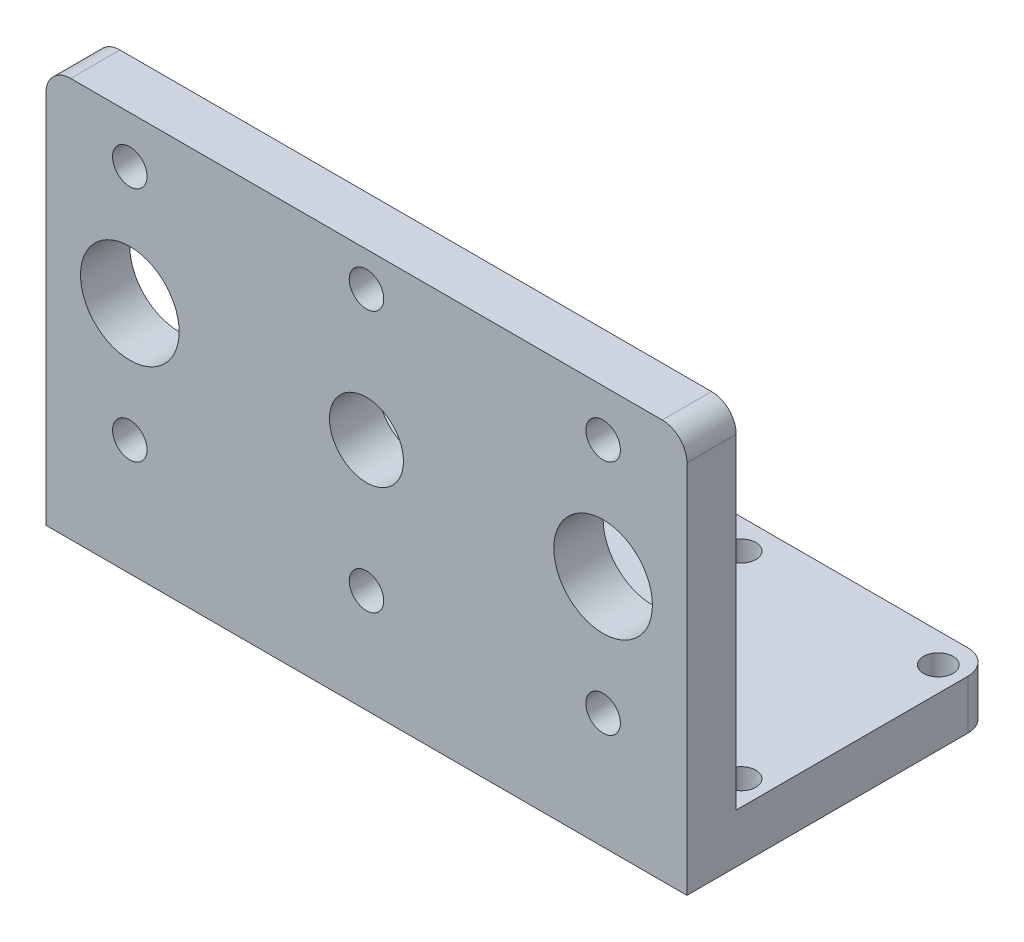
ISO-10303-21;
HEADER;
FILE_DESCRIPTION(('STEP AP214'),'2;1');
FILE_NAME('part.step','',(''),(''),'','','');
FILE_SCHEMA(('AUTOMOTIVE_DESIGN { 1 0 10303 214 1 1 1 1 }'));
ENDSEC;
DATA;
#1=APPLICATION_CONTEXT('core data for automotive mechanical design processes');
#2=APPLICATION_PROTOCOL_DEFINITION('international standard','automotive_design',2000,#1);
#3=PRODUCT_CONTEXT('',#1,'mechanical');
#4=PRODUCT('Part','Part','',(#3));
#5=PRODUCT_RELATED_PRODUCT_CATEGORY('part','',(#4));
#6=PRODUCT_DEFINITION_FORMATION('','',#4);
#7=PRODUCT_DEFINITION_CONTEXT('part definition',#1,'design');
#8=PRODUCT_DEFINITION('design','',#6,#7);
#9=PRODUCT_DEFINITION_SHAPE('','',#8);
#10=(LENGTH_UNIT() NAMED_UNIT(*) SI_UNIT(.MILLI.,.METRE.));
#11=(NAMED_UNIT(*) PLANE_ANGLE_UNIT() SI_UNIT($,.RADIAN.));
#12=(NAMED_UNIT(*) SI_UNIT($,.STERADIAN.) SOLID_ANGLE_UNIT());
#13=UNCERTAINTY_MEASURE_WITH_UNIT(LENGTH_MEASURE(1.E-05),#10,'distance_accuracy_value','');
#14=(GEOMETRIC_REPRESENTATION_CONTEXT(3) GLOBAL_UNCERTAINTY_ASSIGNED_CONTEXT((#13)) GLOBAL_UNIT_ASSIGNED_CONTEXT((#10,
#11,#12)) REPRESENTATION_CONTEXT('',''));
#15=CARTESIAN_POINT('',(0.,0.,0.));
#16=DIRECTION('',(0.,0.,1.));
#17=DIRECTION('',(1.,0.,0.));
#18=AXIS2_PLACEMENT_3D('',#15,#16,#17);
#19=CARTESIAN_POINT('',(0.,10.,0.));
#20=DIRECTION('',(-1.,0.,0.));
#21=DIRECTION('',(0.,0.,1.));
#22=AXIS2_PLACEMENT_3D('',#19,#20,#21);
#23=PLANE('',#22);
#24=DIRECTION('',(0.,0.,-1.));
#25=VECTOR('',#24,1.);
#26=CARTESIAN_POINT('',(0.,10.,0.));
#27=LINE('',#26,#25);
#28=CARTESIAN_POINT('',(0.,10.,28.9769966783702));
#29=VERTEX_POINT('',#28);
#30=CARTESIAN_POINT('',(0.,10.,-18.));
#31=VERTEX_POINT('',#30);
#32=EDGE_CURVE('E431',#29,#31,#27,.T.);
#33=ORIENTED_EDGE('',*,*,#32,.T.);
#34=DIRECTION('',(0.,1.,0.));
#35=VECTOR('',#34,1.);
#36=CARTESIAN_POINT('',(0.,0.,-18.));
#37=LINE('',#36,#35);
#38=CARTESIAN_POINT('',(0.,0.,-18.));
#39=VERTEX_POINT('',#38);
#40=EDGE_CURVE('E272',#31,#39,#37,.F.);
#41=ORIENTED_EDGE('',*,*,#40,.T.);
#42=DIRECTION('',(0.,0.,-1.));
#43=VECTOR('',#42,1.);
#44=CARTESIAN_POINT('',(0.,0.,0.));
#45=LINE('',#44,#43);
#46=CARTESIAN_POINT('',(0.,0.,38.98));
#47=VERTEX_POINT('',#46);
#48=EDGE_CURVE('E290',#47,#39,#45,.T.);
#49=ORIENTED_EDGE('',*,*,#48,.F.);
#50=DIRECTION('',(0.,-1.,0.));
#51=VECTOR('',#50,1.);
#52=CARTESIAN_POINT('',(0.,0.,38.98));
#53=LINE('',#52,#51);
#54=CARTESIAN_POINT('',(0.,76.,38.98));
#55=VERTEX_POINT('',#54);
#56=EDGE_CURVE('E152',#55,#47,#53,.T.);
#57=ORIENTED_EDGE('',*,*,#56,.F.);
#58=DIRECTION('',(0.,0.,1.));
#59=VECTOR('',#58,1.);
#60=CARTESIAN_POINT('',(0.,76.,0.));
#61=LINE('',#60,#59);
#62=CARTESIAN_POINT('',(0.,76.,28.9769966783702));
#63=VERTEX_POINT('',#62);
#64=EDGE_CURVE('E127',#55,#63,#61,.F.);
#65=ORIENTED_EDGE('',*,*,#64,.T.);
#66=DIRECTION('',(0.,-1.,0.));
#67=VECTOR('',#66,1.);
#68=CARTESIAN_POINT('',(0.,85.,28.9769966783702));
#69=LINE('',#68,#67);
#70=EDGE_CURVE('E242',#63,#29,#69,.T.);
#71=ORIENTED_EDGE('',*,*,#70,.T.);
#72=EDGE_LOOP('',(#33,#41,#49,#57,#65,#71));
#73=FACE_BOUND('',#72,.T.);
#74=ADVANCED_FACE('F44',(#73),#23,.T.);
#75=CARTESIAN_POINT('',(130.,10.,0.));
#76=DIRECTION('',(-1.,0.,0.));
#77=DIRECTION('',(0.,0.,1.));
#78=AXIS2_PLACEMENT_3D('',#75,#76,#77);
#79=PLANE('',#78);
#80=DIRECTION('',(0.,0.,-1.));
#81=VECTOR('',#80,1.);
#82=CARTESIAN_POINT('',(130.,0.,0.));
#83=LINE('',#82,#81);
#84=CARTESIAN_POINT('',(130.,0.,38.98));
#85=VERTEX_POINT('',#84);
#86=CARTESIAN_POINT('',(130.,0.,-18.));
#87=VERTEX_POINT('',#86);
#88=EDGE_CURVE('E426',#85,#87,#83,.T.);
#89=ORIENTED_EDGE('',*,*,#88,.T.);
#90=DIRECTION('',(0.,-1.,0.));
#91=VECTOR('',#90,1.);
#92=CARTESIAN_POINT('',(130.,10.,-18.));
#93=LINE('',#92,#91);
#94=CARTESIAN_POINT('',(130.,10.,-18.));
#95=VERTEX_POINT('',#94);
#96=EDGE_CURVE('E52',#87,#95,#93,.F.);
#97=ORIENTED_EDGE('',*,*,#96,.T.);
#98=DIRECTION('',(0.,0.,-1.));
#99=VECTOR('',#98,1.);
#100=CARTESIAN_POINT('',(130.,10.,0.));
#101=LINE('',#100,#99);
#102=CARTESIAN_POINT('',(130.,10.,28.9769966783702));
#103=VERTEX_POINT('',#102);
#104=EDGE_CURVE('E128',#103,#95,#101,.T.);
#105=ORIENTED_EDGE('',*,*,#104,.F.);
#106=DIRECTION('',(0.,-1.,0.));
#107=VECTOR('',#106,1.);
#108=CARTESIAN_POINT('',(130.,85.,28.9769966783702));
#109=LINE('',#108,#107);
#110=CARTESIAN_POINT('',(130.,76.,28.9769966783702));
#111=VERTEX_POINT('',#110);
#112=EDGE_CURVE('E125',#111,#103,#109,.T.);
#113=ORIENTED_EDGE('',*,*,#112,.F.);
#114=DIRECTION('',(0.,0.,-1.));
#115=VECTOR('',#114,1.);
#116=CARTESIAN_POINT('',(130.,76.,37.));
#117=LINE('',#116,#115);
#118=CARTESIAN_POINT('',(130.,76.,38.98));
#119=VERTEX_POINT('',#118);
#120=EDGE_CURVE('E120',#111,#119,#117,.F.);
#121=ORIENTED_EDGE('',*,*,#120,.T.);
#122=DIRECTION('',(0.,1.,0.));
#123=VECTOR('',#122,1.);
#124=CARTESIAN_POINT('',(130.,0.,38.98));
#125=LINE('',#124,#123);
#126=EDGE_CURVE('E124',#85,#119,#125,.T.);
#127=ORIENTED_EDGE('',*,*,#126,.F.);
#128=EDGE_LOOP('',(#89,#97,#105,#113,#121,#127));
#129=FACE_BOUND('',#128,.T.);
#130=ADVANCED_FACE('F122',(#129),#79,.F.);
#131=CARTESIAN_POINT('',(0.,85.,28.9769966783702));
#132=DIRECTION('',(0.,0.,1.));
#133=DIRECTION('',(1.,0.,0.));
#134=AXIS2_PLACEMENT_3D('',#131,#132,#133);
#135=PLANE('',#134);
#136=CARTESIAN_POINT('',(113.,47.5,28.9769966783702));
#137=DIRECTION('',(0.,0.,-1.));
#138=DIRECTION('',(-1.,0.,0.));
#139=AXIS2_PLACEMENT_3D('',#136,#137,#138);
#140=CIRCLE('',#139,9.99999999999999);
#141=CARTESIAN_POINT('',(103.,47.5,28.9769966783702));
#142=VERTEX_POINT('',#141);
#143=EDGE_CURVE('E230',#142,#142,#140,.T.);
#144=ORIENTED_EDGE('',*,*,#143,.F.);
#145=EDGE_LOOP('',(#144));
#146=FACE_BOUND('',#145,.T.);
#147=CARTESIAN_POINT('',(65.,47.5,28.9769966783702));
#148=DIRECTION('',(0.,0.,-1.));
#149=DIRECTION('',(-1.,0.,0.));
#150=AXIS2_PLACEMENT_3D('',#147,#148,#149);
#151=CIRCLE('',#150,7.5);
#152=CARTESIAN_POINT('',(57.5,47.5,28.9769966783702));
#153=VERTEX_POINT('',#152);
#154=EDGE_CURVE('E227',#153,#153,#151,.T.);
#155=ORIENTED_EDGE('',*,*,#154,.F.);
#156=EDGE_LOOP('',(#155));
#157=FACE_BOUND('',#156,.T.);
#158=CARTESIAN_POINT('',(17.,47.5,28.9769966783702));
#159=DIRECTION('',(0.,0.,-1.));
#160=DIRECTION('',(-1.,0.,0.));
#161=AXIS2_PLACEMENT_3D('',#158,#159,#160);
#162=CIRCLE('',#161,10.);
#163=CARTESIAN_POINT('',(7.,47.5,28.9769966783702));
#164=VERTEX_POINT('',#163);
#165=EDGE_CURVE('E224',#164,#164,#162,.T.);
#166=ORIENTED_EDGE('',*,*,#165,.F.);
#167=EDGE_LOOP('',(#166));
#168=FACE_BOUND('',#167,.T.);
#169=CARTESIAN_POINT('',(113.,71.5,28.9769966783702));
#170=DIRECTION('',(0.,0.,-1.));
#171=DIRECTION('',(-1.,0.,0.));
#172=AXIS2_PLACEMENT_3D('',#169,#170,#171);
#173=CIRCLE('',#172,3.50000000000001);
#174=CARTESIAN_POINT('',(109.5,71.5,28.9769966783702));
#175=VERTEX_POINT('',#174);
#176=EDGE_CURVE('E221',#175,#175,#173,.T.);
#177=ORIENTED_EDGE('',*,*,#176,.F.);
#178=EDGE_LOOP('',(#177));
#179=FACE_BOUND('',#178,.T.);
#180=CARTESIAN_POINT('',(113.,23.5,28.9769966783702));
#181=DIRECTION('',(0.,0.,-1.));
#182=DIRECTION('',(-1.,0.,0.));
#183=AXIS2_PLACEMENT_3D('',#180,#181,#182);
#184=CIRCLE('',#183,3.50000000000001);
#185=CARTESIAN_POINT('',(109.5,23.5,28.9769966783702));
#186=VERTEX_POINT('',#185);
#187=EDGE_CURVE('E218',#186,#186,#184,.T.);
#188=ORIENTED_EDGE('',*,*,#187,.F.);
#189=EDGE_LOOP('',(#188));
#190=FACE_BOUND('',#189,.T.);
#191=CARTESIAN_POINT('',(65.,21.,28.9769966783702));
#192=DIRECTION('',(0.,0.,-1.));
#193=DIRECTION('',(-1.,0.,0.));
#194=AXIS2_PLACEMENT_3D('',#191,#192,#193);
#195=CIRCLE('',#194,3.5);
#196=CARTESIAN_POINT('',(61.5,21.,28.9769966783702));
#197=VERTEX_POINT('',#196);
#198=EDGE_CURVE('E215',#197,#197,#195,.T.);
#199=ORIENTED_EDGE('',*,*,#198,.F.);
#200=EDGE_LOOP('',(#199));
#201=FACE_BOUND('',#200,.T.);
#202=CARTESIAN_POINT('',(65.,74.,28.9769966783702));
#203=DIRECTION('',(0.,0.,-1.));
#204=DIRECTION('',(-1.,0.,0.));
#205=AXIS2_PLACEMENT_3D('',#202,#203,#204);
#206=CIRCLE('',#205,3.5);
#207=CARTESIAN_POINT('',(61.5,74.,28.9769966783702));
#208=VERTEX_POINT('',#207);
#209=EDGE_CURVE('E212',#208,#208,#206,.T.);
#210=ORIENTED_EDGE('',*,*,#209,.F.);
#211=EDGE_LOOP('',(#210));
#212=FACE_BOUND('',#211,.T.);
#213=CARTESIAN_POINT('',(17.,71.5,28.9769966783702));
#214=DIRECTION('',(0.,0.,-1.));
#215=DIRECTION('',(-1.,0.,0.));
#216=AXIS2_PLACEMENT_3D('',#213,#214,#215);
#217=CIRCLE('',#216,3.5);
#218=CARTESIAN_POINT('',(13.5,71.5,28.9769966783702));
#219=VERTEX_POINT('',#218);
#220=EDGE_CURVE('E209',#219,#219,#217,.T.);
#221=ORIENTED_EDGE('',*,*,#220,.F.);
#222=EDGE_LOOP('',(#221));
#223=FACE_BOUND('',#222,.T.);
#224=CARTESIAN_POINT('',(17.,23.5,28.9769966783702));
#225=DIRECTION('',(0.,0.,-1.));
#226=DIRECTION('',(-1.,0.,0.));
#227=AXIS2_PLACEMENT_3D('',#224,#225,#226);
#228=CIRCLE('',#227,3.5);
#229=CARTESIAN_POINT('',(13.5,23.5,28.9769966783702));
#230=VERTEX_POINT('',#229);
#231=EDGE_CURVE('E206',#230,#230,#228,.T.);
#232=ORIENTED_EDGE('',*,*,#231,.F.);
#233=EDGE_LOOP('',(#232));
#234=FACE_BOUND('',#233,.T.);
#235=ORIENTED_EDGE('',*,*,#70,.F.);
#236=CARTESIAN_POINT('',(5.,76.,28.9769966783702));
#237=DIRECTION('',(0.,0.,1.));
#238=DIRECTION('',(1.,0.,0.));
#239=AXIS2_PLACEMENT_3D('',#236,#237,#238);
#240=CIRCLE('',#239,5.);
#241=CARTESIAN_POINT('',(5.,81.,28.9769966783702));
#242=VERTEX_POINT('',#241);
#243=EDGE_CURVE('E257',#63,#242,#240,.F.);
#244=ORIENTED_EDGE('',*,*,#243,.T.);
#245=DIRECTION('',(-1.,0.,0.));
#246=VECTOR('',#245,1.);
#247=CARTESIAN_POINT('',(0.,81.,28.9769966783702));
#248=LINE('',#247,#246);
#249=CARTESIAN_POINT('',(125.,81.,28.9769966783702));
#250=VERTEX_POINT('',#249);
#251=EDGE_CURVE('E203',#250,#242,#248,.T.);
#252=ORIENTED_EDGE('',*,*,#251,.F.);
#253=CARTESIAN_POINT('',(125.,76.,28.9769966783702));
#254=DIRECTION('',(0.,0.,1.));
#255=DIRECTION('',(1.,0.,0.));
#256=AXIS2_PLACEMENT_3D('',#253,#254,#255);
#257=CIRCLE('',#256,5.);
#258=EDGE_CURVE('E255',#250,#111,#257,.F.);
#259=ORIENTED_EDGE('',*,*,#258,.T.);
#260=ORIENTED_EDGE('',*,*,#112,.T.);
#261=DIRECTION('',(-1.,0.,0.));
#262=VECTOR('',#261,1.);
#263=CARTESIAN_POINT('',(0.,10.,28.9769966783702));
#264=LINE('',#263,#262);
#265=EDGE_CURVE('E233',#103,#29,#264,.T.);
#266=ORIENTED_EDGE('',*,*,#265,.T.);
#267=EDGE_LOOP('',(#235,#244,#252,#259,#260,#266));
#268=FACE_BOUND('',#267,.T.);
#269=ADVANCED_FACE('F312',(#146,#157,#168,#179,#190,#201,#212,#223,#234,#268),#135,.F.);
#270=CARTESIAN_POINT('',(5.,10.,-17.));
#271=DIRECTION('',(0.,-1.,0.));
#272=DIRECTION('',(0.,0.,-1.));
#273=AXIS2_PLACEMENT_3D('',#270,#271,#272);
#274=CYLINDRICAL_SURFACE('',#273,3.);
#275=CARTESIAN_POINT('',(5.,10.,-17.));
#276=DIRECTION('',(0.,1.,0.));
#277=DIRECTION('',(0.,0.,1.));
#278=AXIS2_PLACEMENT_3D('',#275,#276,#277);
#279=CIRCLE('',#278,3.);
#280=CARTESIAN_POINT('',(5.,10.,-14.));
#281=VERTEX_POINT('',#280);
#282=EDGE_CURVE('E433',#281,#281,#279,.T.);
#283=ORIENTED_EDGE('',*,*,#282,.T.);
#284=EDGE_LOOP('',(#283));
#285=FACE_BOUND('',#284,.T.);
#286=CARTESIAN_POINT('',(5.,0.,-17.));
#287=DIRECTION('',(0.,1.,0.));
#288=DIRECTION('',(0.,0.,1.));
#289=AXIS2_PLACEMENT_3D('',#286,#287,#288);
#290=CIRCLE('',#289,3.);
#291=CARTESIAN_POINT('',(5.,0.,-14.));
#292=VERTEX_POINT('',#291);
#293=EDGE_CURVE('E423',#292,#292,#290,.T.);
#294=ORIENTED_EDGE('',*,*,#293,.F.);
#295=EDGE_LOOP('',(#294));
#296=FACE_BOUND('',#295,.T.);
#297=ADVANCED_FACE('F316',(#285,#296),#274,.F.);
#298=CARTESIAN_POINT('',(45.,10.,-17.));
#299=DIRECTION('',(0.,-1.,0.));
#300=DIRECTION('',(0.,0.,-1.));
#301=AXIS2_PLACEMENT_3D('',#298,#299,#300);
#302=CYLINDRICAL_SURFACE('',#301,3.);
#303=CARTESIAN_POINT('',(45.,10.,-17.));
#304=DIRECTION('',(0.,1.,0.));
#305=DIRECTION('',(0.,0.,1.));
#306=AXIS2_PLACEMENT_3D('',#303,#304,#305);
#307=CIRCLE('',#306,3.);
#308=CARTESIAN_POINT('',(45.,10.,-14.));
#309=VERTEX_POINT('',#308);
#310=EDGE_CURVE('E447',#309,#309,#307,.T.);
#311=ORIENTED_EDGE('',*,*,#310,.T.);
#312=EDGE_LOOP('',(#311));
#313=FACE_BOUND('',#312,.T.);
#314=CARTESIAN_POINT('',(45.,0.,-17.));
#315=DIRECTION('',(0.,1.,0.));
#316=DIRECTION('',(0.,0.,1.));
#317=AXIS2_PLACEMENT_3D('',#314,#315,#316);
#318=CIRCLE('',#317,3.);
#319=CARTESIAN_POINT('',(45.,0.,-14.));
#320=VERTEX_POINT('',#319);
#321=EDGE_CURVE('E420',#320,#320,#318,.T.);
#322=ORIENTED_EDGE('',*,*,#321,.F.);
#323=EDGE_LOOP('',(#322));
#324=FACE_BOUND('',#323,.T.);
#325=ADVANCED_FACE('F319',(#313,#324),#302,.F.);
#326=CARTESIAN_POINT('',(85.,10.,-17.));
#327=DIRECTION('',(0.,-1.,0.));
#328=DIRECTION('',(0.,0.,-1.));
#329=AXIS2_PLACEMENT_3D('',#326,#327,#328);
#330=CYLINDRICAL_SURFACE('',#329,3.00000000000001);
#331=CARTESIAN_POINT('',(85.,10.,-17.));
#332=DIRECTION('',(0.,1.,0.));
#333=DIRECTION('',(0.,0.,1.));
#334=AXIS2_PLACEMENT_3D('',#331,#332,#333);
#335=CIRCLE('',#334,3.00000000000001);
#336=CARTESIAN_POINT('',(85.,10.,-14.));
#337=VERTEX_POINT('',#336);
#338=EDGE_CURVE('E449',#337,#337,#335,.T.);
#339=ORIENTED_EDGE('',*,*,#338,.T.);
#340=EDGE_LOOP('',(#339));
#341=FACE_BOUND('',#340,.T.);
#342=CARTESIAN_POINT('',(85.,0.,-17.));
#343=DIRECTION('',(0.,1.,0.));
#344=DIRECTION('',(0.,0.,1.));
#345=AXIS2_PLACEMENT_3D('',#342,#343,#344);
#346=CIRCLE('',#345,3.00000000000001);
#347=CARTESIAN_POINT('',(85.,0.,-14.));
#348=VERTEX_POINT('',#347);
#349=EDGE_CURVE('E416',#348,#348,#346,.T.);
#350=ORIENTED_EDGE('',*,*,#349,.F.);
#351=EDGE_LOOP('',(#350));
#352=FACE_BOUND('',#351,.T.);
#353=ADVANCED_FACE('F323',(#341,#352),#330,.F.);
#354=CARTESIAN_POINT('',(125.,10.,-17.));
#355=DIRECTION('',(0.,-1.,0.));
#356=DIRECTION('',(0.,0.,-1.));
#357=AXIS2_PLACEMENT_3D('',#354,#355,#356);
#358=CYLINDRICAL_SURFACE('',#357,2.99999999999999);
#359=CARTESIAN_POINT('',(125.,10.,-17.));
#360=DIRECTION('',(0.,1.,0.));
#361=DIRECTION('',(0.,0.,1.));
#362=AXIS2_PLACEMENT_3D('',#359,#360,#361);
#363=CIRCLE('',#362,2.99999999999999);
#364=CARTESIAN_POINT('',(125.,10.,-14.));
#365=VERTEX_POINT('',#364);
#366=EDGE_CURVE('E236',#365,#365,#363,.T.);
#367=ORIENTED_EDGE('',*,*,#366,.T.);
#368=EDGE_LOOP('',(#367));
#369=FACE_BOUND('',#368,.T.);
#370=CARTESIAN_POINT('',(125.,0.,-17.));
#371=DIRECTION('',(0.,1.,0.));
#372=DIRECTION('',(0.,0.,1.));
#373=AXIS2_PLACEMENT_3D('',#370,#371,#372);
#374=CIRCLE('',#373,2.99999999999999);
#375=CARTESIAN_POINT('',(125.,0.,-14.));
#376=VERTEX_POINT('',#375);
#377=EDGE_CURVE('E412',#376,#376,#374,.T.);
#378=ORIENTED_EDGE('',*,*,#377,.F.);
#379=EDGE_LOOP('',(#378));
#380=FACE_BOUND('',#379,.T.);
#381=ADVANCED_FACE('F327',(#369,#380),#358,.F.);
#382=CARTESIAN_POINT('',(0.,10.,0.));
#383=DIRECTION('',(0.,1.,0.));
#384=DIRECTION('',(0.,0.,1.));
#385=AXIS2_PLACEMENT_3D('',#382,#383,#384);
#386=PLANE('',#385);
#387=ORIENTED_EDGE('',*,*,#104,.T.);
#388=CARTESIAN_POINT('',(125.,10.,-18.));
#389=DIRECTION('',(0.,1.,0.));
#390=DIRECTION('',(0.,0.,1.));
#391=AXIS2_PLACEMENT_3D('',#388,#389,#390);
#392=CIRCLE('',#391,5.);
#393=CARTESIAN_POINT('',(125.,10.,-23.));
#394=VERTEX_POINT('',#393);
#395=EDGE_CURVE('E12',#95,#394,#392,.T.);
#396=ORIENTED_EDGE('',*,*,#395,.T.);
#397=DIRECTION('',(1.,0.,0.));
#398=VECTOR('',#397,1.);
#399=CARTESIAN_POINT('',(130.,10.,-23.));
#400=LINE('',#399,#398);
#401=CARTESIAN_POINT('',(5.,10.,-23.));
#402=VERTEX_POINT('',#401);
#403=EDGE_CURVE('E184',#402,#394,#400,.T.);
#404=ORIENTED_EDGE('',*,*,#403,.F.);
#405=CARTESIAN_POINT('',(5.,10.,-18.));
#406=DIRECTION('',(0.,1.,0.));
#407=DIRECTION('',(0.,0.,1.));
#408=AXIS2_PLACEMENT_3D('',#405,#406,#407);
#409=CIRCLE('',#408,5.);
#410=EDGE_CURVE('E270',#402,#31,#409,.T.);
#411=ORIENTED_EDGE('',*,*,#410,.T.);
#412=ORIENTED_EDGE('',*,*,#32,.F.);
#413=ORIENTED_EDGE('',*,*,#265,.F.);
#414=EDGE_LOOP('',(#387,#396,#404,#411,#412,#413));
#415=FACE_BOUND('',#414,.T.);
#416=CARTESIAN_POINT('',(125.,10.,23.));
#417=DIRECTION('',(0.,1.,0.));
#418=DIRECTION('',(0.,0.,1.));
#419=AXIS2_PLACEMENT_3D('',#416,#417,#418);
#420=CIRCLE('',#419,2.99999999999999);
#421=CARTESIAN_POINT('',(125.,10.,26.));
#422=VERTEX_POINT('',#421);
#423=EDGE_CURVE('E187',#422,#422,#420,.T.);
#424=ORIENTED_EDGE('',*,*,#423,.F.);
#425=EDGE_LOOP('',(#424));
#426=FACE_BOUND('',#425,.T.);
#427=CARTESIAN_POINT('',(85.,10.,23.));
#428=DIRECTION('',(0.,1.,0.));
#429=DIRECTION('',(0.,0.,1.));
#430=AXIS2_PLACEMENT_3D('',#427,#428,#429);
#431=CIRCLE('',#430,3.00000000000001);
#432=CARTESIAN_POINT('',(85.,10.,26.));
#433=VERTEX_POINT('',#432);
#434=EDGE_CURVE('E191',#433,#433,#431,.T.);
#435=ORIENTED_EDGE('',*,*,#434,.F.);
#436=EDGE_LOOP('',(#435));
#437=FACE_BOUND('',#436,.T.);
#438=CARTESIAN_POINT('',(45.,10.,23.));
#439=DIRECTION('',(0.,1.,0.));
#440=DIRECTION('',(0.,0.,1.));
#441=AXIS2_PLACEMENT_3D('',#438,#439,#440);
#442=CIRCLE('',#441,3.);
#443=CARTESIAN_POINT('',(45.,10.,26.));
#444=VERTEX_POINT('',#443);
#445=EDGE_CURVE('E195',#444,#444,#442,.T.);
#446=ORIENTED_EDGE('',*,*,#445,.F.);
#447=EDGE_LOOP('',(#446));
#448=FACE_BOUND('',#447,.T.);
#449=CARTESIAN_POINT('',(5.00000000000001,10.,23.));
#450=DIRECTION('',(0.,1.,0.));
#451=DIRECTION('',(0.,0.,1.));
#452=AXIS2_PLACEMENT_3D('',#449,#450,#451);
#453=CIRCLE('',#452,3.);
#454=CARTESIAN_POINT('',(5.00000000000001,10.,26.));
#455=VERTEX_POINT('',#454);
#456=EDGE_CURVE('E199',#455,#455,#453,.T.);
#457=ORIENTED_EDGE('',*,*,#456,.F.);
#458=EDGE_LOOP('',(#457));
#459=FACE_BOUND('',#458,.T.);
#460=ORIENTED_EDGE('',*,*,#366,.F.);
#461=EDGE_LOOP('',(#460));
#462=FACE_BOUND('',#461,.T.);
#463=ORIENTED_EDGE('',*,*,#338,.F.);
#464=EDGE_LOOP('',(#463));
#465=FACE_BOUND('',#464,.T.);
#466=ORIENTED_EDGE('',*,*,#310,.F.);
#467=EDGE_LOOP('',(#466));
#468=FACE_BOUND('',#467,.T.);
#469=ORIENTED_EDGE('',*,*,#282,.F.);
#470=EDGE_LOOP('',(#469));
#471=FACE_BOUND('',#470,.T.);
#472=ADVANCED_FACE('F295',(#415,#426,#437,#448,#459,#462,#465,#468,#471),#386,.T.);
#473=CARTESIAN_POINT('',(0.,0.,0.));
#474=DIRECTION('',(0.,1.,0.));
#475=DIRECTION('',(0.,0.,1.));
#476=AXIS2_PLACEMENT_3D('',#473,#474,#475);
#477=PLANE('',#476);
#478=CARTESIAN_POINT('',(125.,0.,23.));
#479=DIRECTION('',(0.,1.,0.));
#480=DIRECTION('',(0.,0.,1.));
#481=AXIS2_PLACEMENT_3D('',#478,#479,#480);
#482=CIRCLE('',#481,2.99999999999999);
#483=CARTESIAN_POINT('',(125.,0.,26.));
#484=VERTEX_POINT('',#483);
#485=EDGE_CURVE('E190',#484,#484,#482,.T.);
#486=ORIENTED_EDGE('',*,*,#485,.T.);
#487=EDGE_LOOP('',(#486));
#488=FACE_BOUND('',#487,.T.);
#489=CARTESIAN_POINT('',(85.,0.,23.));
#490=DIRECTION('',(0.,1.,0.));
#491=DIRECTION('',(0.,0.,1.));
#492=AXIS2_PLACEMENT_3D('',#489,#490,#491);
#493=CIRCLE('',#492,3.00000000000001);
#494=CARTESIAN_POINT('',(85.,0.,26.));
#495=VERTEX_POINT('',#494);
#496=EDGE_CURVE('E194',#495,#495,#493,.T.);
#497=ORIENTED_EDGE('',*,*,#496,.T.);
#498=EDGE_LOOP('',(#497));
#499=FACE_BOUND('',#498,.T.);
#500=CARTESIAN_POINT('',(45.,0.,23.));
#501=DIRECTION('',(0.,1.,0.));
#502=DIRECTION('',(0.,0.,1.));
#503=AXIS2_PLACEMENT_3D('',#500,#501,#502);
#504=CIRCLE('',#503,3.);
#505=CARTESIAN_POINT('',(45.,0.,26.));
#506=VERTEX_POINT('',#505);
#507=EDGE_CURVE('E198',#506,#506,#504,.T.);
#508=ORIENTED_EDGE('',*,*,#507,.T.);
#509=EDGE_LOOP('',(#508));
#510=FACE_BOUND('',#509,.T.);
#511=CARTESIAN_POINT('',(5.00000000000001,0.,23.));
#512=DIRECTION('',(0.,1.,0.));
#513=DIRECTION('',(0.,0.,1.));
#514=AXIS2_PLACEMENT_3D('',#511,#512,#513);
#515=CIRCLE('',#514,3.);
#516=CARTESIAN_POINT('',(5.00000000000001,0.,26.));
#517=VERTEX_POINT('',#516);
#518=EDGE_CURVE('E202',#517,#517,#515,.T.);
#519=ORIENTED_EDGE('',*,*,#518,.T.);
#520=EDGE_LOOP('',(#519));
#521=FACE_BOUND('',#520,.T.);
#522=ORIENTED_EDGE('',*,*,#377,.T.);
#523=EDGE_LOOP('',(#522));
#524=FACE_BOUND('',#523,.T.);
#525=ORIENTED_EDGE('',*,*,#349,.T.);
#526=EDGE_LOOP('',(#525));
#527=FACE_BOUND('',#526,.T.);
#528=ORIENTED_EDGE('',*,*,#321,.T.);
#529=EDGE_LOOP('',(#528));
#530=FACE_BOUND('',#529,.T.);
#531=ORIENTED_EDGE('',*,*,#293,.T.);
#532=EDGE_LOOP('',(#531));
#533=FACE_BOUND('',#532,.T.);
#534=DIRECTION('',(-1.,0.,0.));
#535=VECTOR('',#534,1.);
#536=CARTESIAN_POINT('',(130.,0.,-23.));
#537=LINE('',#536,#535);
#538=CARTESIAN_POINT('',(125.,0.,-23.));
#539=VERTEX_POINT('',#538);
#540=CARTESIAN_POINT('',(5.,0.,-23.));
#541=VERTEX_POINT('',#540);
#542=EDGE_CURVE('E182',#539,#541,#537,.T.);
#543=ORIENTED_EDGE('',*,*,#542,.F.);
#544=CARTESIAN_POINT('',(125.,0.,-18.));
#545=DIRECTION('',(0.,1.,0.));
#546=DIRECTION('',(0.,0.,1.));
#547=AXIS2_PLACEMENT_3D('',#544,#545,#546);
#548=CIRCLE('',#547,5.);
#549=EDGE_CURVE('E66',#539,#87,#548,.F.);
#550=ORIENTED_EDGE('',*,*,#549,.T.);
#551=ORIENTED_EDGE('',*,*,#88,.F.);
#552=DIRECTION('',(1.,0.,0.));
#553=VECTOR('',#552,1.);
#554=CARTESIAN_POINT('',(0.,0.,38.98));
#555=LINE('',#554,#553);
#556=EDGE_CURVE('E145',#47,#85,#555,.T.);
#557=ORIENTED_EDGE('',*,*,#556,.F.);
#558=ORIENTED_EDGE('',*,*,#48,.T.);
#559=CARTESIAN_POINT('',(5.,0.,-18.));
#560=DIRECTION('',(0.,1.,0.));
#561=DIRECTION('',(0.,0.,1.));
#562=AXIS2_PLACEMENT_3D('',#559,#560,#561);
#563=CIRCLE('',#562,5.);
#564=EDGE_CURVE('E274',#39,#541,#563,.F.);
#565=ORIENTED_EDGE('',*,*,#564,.T.);
#566=EDGE_LOOP('',(#543,#550,#551,#557,#558,#565));
#567=FACE_BOUND('',#566,.T.);
#568=ADVANCED_FACE('F286',(#488,#499,#510,#521,#524,#527,#530,#533,#567),#477,.F.);
#569=CARTESIAN_POINT('',(113.,47.5,103.97699667837));
#570=DIRECTION('',(0.,0.,-1.));
#571=DIRECTION('',(-1.,0.,0.));
#572=AXIS2_PLACEMENT_3D('',#569,#570,#571);
#573=CYLINDRICAL_SURFACE('',#572,9.99999999999999);
#574=ORIENTED_EDGE('',*,*,#143,.T.);
#575=EDGE_LOOP('',(#574));
#576=FACE_BOUND('',#575,.T.);
#577=CARTESIAN_POINT('',(113.,47.5,38.98));
#578=DIRECTION('',(0.,0.,1.));
#579=DIRECTION('',(1.,0.,0.));
#580=AXIS2_PLACEMENT_3D('',#577,#578,#579);
#581=CIRCLE('',#580,9.99999999999999);
#582=CARTESIAN_POINT('',(123.,47.5,38.98));
#583=VERTEX_POINT('',#582);
#584=EDGE_CURVE('E155',#583,#583,#581,.F.);
#585=ORIENTED_EDGE('',*,*,#584,.F.);
#586=EDGE_LOOP('',(#585));
#587=FACE_BOUND('',#586,.T.);
#588=ADVANCED_FACE('F388',(#576,#587),#573,.F.);
#589=CARTESIAN_POINT('',(65.,47.5,103.97699667837));
#590=DIRECTION('',(0.,0.,-1.));
#591=DIRECTION('',(-1.,0.,0.));
#592=AXIS2_PLACEMENT_3D('',#589,#590,#591);
#593=CYLINDRICAL_SURFACE('',#592,7.5);
#594=ORIENTED_EDGE('',*,*,#154,.T.);
#595=EDGE_LOOP('',(#594));
#596=FACE_BOUND('',#595,.T.);
#597=CARTESIAN_POINT('',(65.,47.5,38.98));
#598=DIRECTION('',(0.,0.,1.));
#599=DIRECTION('',(1.,0.,0.));
#600=AXIS2_PLACEMENT_3D('',#597,#598,#599);
#601=CIRCLE('',#600,7.5);
#602=CARTESIAN_POINT('',(72.5,47.5,38.98));
#603=VERTEX_POINT('',#602);
#604=EDGE_CURVE('E158',#603,#603,#601,.F.);
#605=ORIENTED_EDGE('',*,*,#604,.F.);
#606=EDGE_LOOP('',(#605));
#607=FACE_BOUND('',#606,.T.);
#608=ADVANCED_FACE('F384',(#596,#607),#593,.F.);
#609=CARTESIAN_POINT('',(17.,47.5,103.97699667837));
#610=DIRECTION('',(0.,0.,-1.));
#611=DIRECTION('',(-1.,0.,0.));
#612=AXIS2_PLACEMENT_3D('',#609,#610,#611);
#613=CYLINDRICAL_SURFACE('',#612,10.);
#614=ORIENTED_EDGE('',*,*,#165,.T.);
#615=EDGE_LOOP('',(#614));
#616=FACE_BOUND('',#615,.T.);
#617=CARTESIAN_POINT('',(17.,47.5,38.98));
#618=DIRECTION('',(0.,0.,1.));
#619=DIRECTION('',(1.,0.,0.));
#620=AXIS2_PLACEMENT_3D('',#617,#618,#619);
#621=CIRCLE('',#620,10.);
#622=CARTESIAN_POINT('',(27.,47.5,38.98));
#623=VERTEX_POINT('',#622);
#624=EDGE_CURVE('E170',#623,#623,#621,.F.);
#625=ORIENTED_EDGE('',*,*,#624,.F.);
#626=EDGE_LOOP('',(#625));
#627=FACE_BOUND('',#626,.T.);
#628=ADVANCED_FACE('F380',(#616,#627),#613,.F.);
#629=CARTESIAN_POINT('',(113.,71.5,38.9769966783702));
#630=DIRECTION('',(0.,0.,-1.));
#631=DIRECTION('',(-1.,0.,0.));
#632=AXIS2_PLACEMENT_3D('',#629,#630,#631);
#633=CYLINDRICAL_SURFACE('',#632,3.50000000000001);
#634=ORIENTED_EDGE('',*,*,#176,.T.);
#635=EDGE_LOOP('',(#634));
#636=FACE_BOUND('',#635,.T.);
#637=CARTESIAN_POINT('',(113.,71.5,38.98));
#638=DIRECTION('',(0.,0.,1.));
#639=DIRECTION('',(1.,0.,0.));
#640=AXIS2_PLACEMENT_3D('',#637,#638,#639);
#641=CIRCLE('',#640,3.50000000000001);
#642=CARTESIAN_POINT('',(116.5,71.5,38.98));
#643=VERTEX_POINT('',#642);
#644=EDGE_CURVE('E179',#643,#643,#641,.F.);
#645=ORIENTED_EDGE('',*,*,#644,.F.);
#646=EDGE_LOOP('',(#645));
#647=FACE_BOUND('',#646,.T.);
#648=ADVANCED_FACE('F376',(#636,#647),#633,.F.);
#649=CARTESIAN_POINT('',(113.,23.5,38.9769966783702));
#650=DIRECTION('',(0.,0.,-1.));
#651=DIRECTION('',(-1.,0.,0.));
#652=AXIS2_PLACEMENT_3D('',#649,#650,#651);
#653=CYLINDRICAL_SURFACE('',#652,3.50000000000001);
#654=ORIENTED_EDGE('',*,*,#187,.T.);
#655=EDGE_LOOP('',(#654));
#656=FACE_BOUND('',#655,.T.);
#657=CARTESIAN_POINT('',(113.,23.5,38.98));
#658=DIRECTION('',(0.,0.,1.));
#659=DIRECTION('',(1.,0.,0.));
#660=AXIS2_PLACEMENT_3D('',#657,#658,#659);
#661=CIRCLE('',#660,3.50000000000001);
#662=CARTESIAN_POINT('',(116.5,23.5,38.98));
#663=VERTEX_POINT('',#662);
#664=EDGE_CURVE('E176',#663,#663,#661,.F.);
#665=ORIENTED_EDGE('',*,*,#664,.F.);
#666=EDGE_LOOP('',(#665));
#667=FACE_BOUND('',#666,.T.);
#668=ADVANCED_FACE('F372',(#656,#667),#653,.F.);
#669=CARTESIAN_POINT('',(65.,21.,38.9769966783702));
#670=DIRECTION('',(0.,0.,-1.));
#671=DIRECTION('',(-1.,0.,0.));
#672=AXIS2_PLACEMENT_3D('',#669,#670,#671);
#673=CYLINDRICAL_SURFACE('',#672,3.5);
#674=ORIENTED_EDGE('',*,*,#198,.T.);
#675=EDGE_LOOP('',(#674));
#676=FACE_BOUND('',#675,.T.);
#677=CARTESIAN_POINT('',(65.,21.,38.98));
#678=DIRECTION('',(0.,0.,1.));
#679=DIRECTION('',(1.,0.,0.));
#680=AXIS2_PLACEMENT_3D('',#677,#678,#679);
#681=CIRCLE('',#680,3.5);
#682=CARTESIAN_POINT('',(68.5,21.,38.98));
#683=VERTEX_POINT('',#682);
#684=EDGE_CURVE('E173',#683,#683,#681,.F.);
#685=ORIENTED_EDGE('',*,*,#684,.F.);
#686=EDGE_LOOP('',(#685));
#687=FACE_BOUND('',#686,.T.);
#688=ADVANCED_FACE('F368',(#676,#687),#673,.F.);
#689=CARTESIAN_POINT('',(65.,74.,38.9769966783702));
#690=DIRECTION('',(0.,0.,-1.));
#691=DIRECTION('',(-1.,0.,0.));
#692=AXIS2_PLACEMENT_3D('',#689,#690,#691);
#693=CYLINDRICAL_SURFACE('',#692,3.5);
#694=ORIENTED_EDGE('',*,*,#209,.T.);
#695=EDGE_LOOP('',(#694));
#696=FACE_BOUND('',#695,.T.);
#697=CARTESIAN_POINT('',(65.,74.,38.98));
#698=DIRECTION('',(0.,0.,1.));
#699=DIRECTION('',(1.,0.,0.));
#700=AXIS2_PLACEMENT_3D('',#697,#698,#699);
#701=CIRCLE('',#700,3.5);
#702=CARTESIAN_POINT('',(68.5,74.,38.98));
#703=VERTEX_POINT('',#702);
#704=EDGE_CURVE('E161',#703,#703,#701,.F.);
#705=ORIENTED_EDGE('',*,*,#704,.F.);
#706=EDGE_LOOP('',(#705));
#707=FACE_BOUND('',#706,.T.);
#708=ADVANCED_FACE('F364',(#696,#707),#693,.F.);
#709=CARTESIAN_POINT('',(17.,71.5,38.9769966783702));
#710=DIRECTION('',(0.,0.,-1.));
#711=DIRECTION('',(-1.,0.,0.));
#712=AXIS2_PLACEMENT_3D('',#709,#710,#711);
#713=CYLINDRICAL_SURFACE('',#712,3.5);
#714=ORIENTED_EDGE('',*,*,#220,.T.);
#715=EDGE_LOOP('',(#714));
#716=FACE_BOUND('',#715,.T.);
#717=CARTESIAN_POINT('',(17.,71.5,38.98));
#718=DIRECTION('',(0.,0.,1.));
#719=DIRECTION('',(1.,0.,0.));
#720=AXIS2_PLACEMENT_3D('',#717,#718,#719);
#721=CIRCLE('',#720,3.5);
#722=CARTESIAN_POINT('',(20.5,71.5,38.98));
#723=VERTEX_POINT('',#722);
#724=EDGE_CURVE('E164',#723,#723,#721,.F.);
#725=ORIENTED_EDGE('',*,*,#724,.F.);
#726=EDGE_LOOP('',(#725));
#727=FACE_BOUND('',#726,.T.);
#728=ADVANCED_FACE('F360',(#716,#727),#713,.F.);
#729=CARTESIAN_POINT('',(17.,23.5,38.9769966783702));
#730=DIRECTION('',(0.,0.,-1.));
#731=DIRECTION('',(-1.,0.,0.));
#732=AXIS2_PLACEMENT_3D('',#729,#730,#731);
#733=CYLINDRICAL_SURFACE('',#732,3.5);
#734=ORIENTED_EDGE('',*,*,#231,.T.);
#735=EDGE_LOOP('',(#734));
#736=FACE_BOUND('',#735,.T.);
#737=CARTESIAN_POINT('',(17.,23.5,38.98));
#738=DIRECTION('',(0.,0.,1.));
#739=DIRECTION('',(1.,0.,0.));
#740=AXIS2_PLACEMENT_3D('',#737,#738,#739);
#741=CIRCLE('',#740,3.5);
#742=CARTESIAN_POINT('',(20.5,23.5,38.98));
#743=VERTEX_POINT('',#742);
#744=EDGE_CURVE('E167',#743,#743,#741,.F.);
#745=ORIENTED_EDGE('',*,*,#744,.F.);
#746=EDGE_LOOP('',(#745));
#747=FACE_BOUND('',#746,.T.);
#748=ADVANCED_FACE('F356',(#736,#747),#733,.F.);
#749=CARTESIAN_POINT('',(0.,81.,0.));
#750=DIRECTION('',(0.,1.,0.));
#751=DIRECTION('',(0.,0.,1.));
#752=AXIS2_PLACEMENT_3D('',#749,#750,#751);
#753=PLANE('',#752);
#754=ORIENTED_EDGE('',*,*,#251,.T.);
#755=DIRECTION('',(0.,0.,1.));
#756=VECTOR('',#755,1.);
#757=CARTESIAN_POINT('',(5.,81.,0.));
#758=LINE('',#757,#756);
#759=CARTESIAN_POINT('',(5.,81.,38.98));
#760=VERTEX_POINT('',#759);
#761=EDGE_CURVE('E253',#242,#760,#758,.T.);
#762=ORIENTED_EDGE('',*,*,#761,.T.);
#763=DIRECTION('',(-1.,0.,0.));
#764=VECTOR('',#763,1.);
#765=CARTESIAN_POINT('',(0.,81.,38.98));
#766=LINE('',#765,#764);
#767=CARTESIAN_POINT('',(125.,81.,38.98));
#768=VERTEX_POINT('',#767);
#769=EDGE_CURVE('E138',#768,#760,#766,.T.);
#770=ORIENTED_EDGE('',*,*,#769,.F.);
#771=DIRECTION('',(0.,0.,-1.));
#772=VECTOR('',#771,1.);
#773=CARTESIAN_POINT('',(125.,81.,28.9769966783702));
#774=LINE('',#773,#772);
#775=EDGE_CURVE('E134',#768,#250,#774,.T.);
#776=ORIENTED_EDGE('',*,*,#775,.T.);
#777=EDGE_LOOP('',(#754,#762,#770,#776));
#778=FACE_BOUND('',#777,.T.);
#779=ADVANCED_FACE('F335',(#778),#753,.T.);
#780=CARTESIAN_POINT('',(5.,76.,0.));
#781=DIRECTION('',(0.,0.,1.));
#782=DIRECTION('',(1.,0.,0.));
#783=AXIS2_PLACEMENT_3D('',#780,#781,#782);
#784=CYLINDRICAL_SURFACE('',#783,5.);
#785=ORIENTED_EDGE('',*,*,#243,.F.);
#786=ORIENTED_EDGE('',*,*,#64,.F.);
#787=CARTESIAN_POINT('',(5.,76.,38.98));
#788=DIRECTION('',(0.,0.,1.));
#789=DIRECTION('',(1.,0.,0.));
#790=AXIS2_PLACEMENT_3D('',#787,#788,#789);
#791=CIRCLE('',#790,5.);
#792=EDGE_CURVE('E149',#760,#55,#791,.T.);
#793=ORIENTED_EDGE('',*,*,#792,.F.);
#794=ORIENTED_EDGE('',*,*,#761,.F.);
#795=EDGE_LOOP('',(#785,#786,#793,#794));
#796=FACE_BOUND('',#795,.T.);
#797=ADVANCED_FACE('F332',(#796),#784,.T.);
#798=CARTESIAN_POINT('',(125.,76.,0.));
#799=DIRECTION('',(0.,0.,1.));
#800=DIRECTION('',(1.,0.,0.));
#801=AXIS2_PLACEMENT_3D('',#798,#799,#800);
#802=CYLINDRICAL_SURFACE('',#801,5.);
#803=ORIENTED_EDGE('',*,*,#775,.F.);
#804=CARTESIAN_POINT('',(125.,76.,38.98));
#805=DIRECTION('',(0.,0.,1.));
#806=DIRECTION('',(1.,0.,0.));
#807=AXIS2_PLACEMENT_3D('',#804,#805,#806);
#808=CIRCLE('',#807,5.);
#809=EDGE_CURVE('E131',#119,#768,#808,.T.);
#810=ORIENTED_EDGE('',*,*,#809,.F.);
#811=ORIENTED_EDGE('',*,*,#120,.F.);
#812=ORIENTED_EDGE('',*,*,#258,.F.);
#813=EDGE_LOOP('',(#803,#810,#811,#812));
#814=FACE_BOUND('',#813,.T.);
#815=ADVANCED_FACE('F132',(#814),#802,.T.);
#816=CARTESIAN_POINT('',(5.00000000000001,-490.,23.));
#817=DIRECTION('',(0.,1.,0.));
#818=DIRECTION('',(0.,0.,1.));
#819=AXIS2_PLACEMENT_3D('',#816,#817,#818);
#820=CYLINDRICAL_SURFACE('',#819,3.);
#821=ORIENTED_EDGE('',*,*,#456,.T.);
#822=EDGE_LOOP('',(#821));
#823=FACE_BOUND('',#822,.T.);
#824=ORIENTED_EDGE('',*,*,#518,.F.);
#825=EDGE_LOOP('',(#824));
#826=FACE_BOUND('',#825,.T.);
#827=ADVANCED_FACE('F338',(#823,#826),#820,.F.);
#828=CARTESIAN_POINT('',(45.,-490.,23.));
#829=DIRECTION('',(0.,1.,0.));
#830=DIRECTION('',(0.,0.,1.));
#831=AXIS2_PLACEMENT_3D('',#828,#829,#830);
#832=CYLINDRICAL_SURFACE('',#831,3.);
#833=ORIENTED_EDGE('',*,*,#445,.T.);
#834=EDGE_LOOP('',(#833));
#835=FACE_BOUND('',#834,.T.);
#836=ORIENTED_EDGE('',*,*,#507,.F.);
#837=EDGE_LOOP('',(#836));
#838=FACE_BOUND('',#837,.T.);
#839=ADVANCED_FACE('F342',(#835,#838),#832,.F.);
#840=CARTESIAN_POINT('',(85.,-490.,23.));
#841=DIRECTION('',(0.,1.,0.));
#842=DIRECTION('',(0.,0.,1.));
#843=AXIS2_PLACEMENT_3D('',#840,#841,#842);
#844=CYLINDRICAL_SURFACE('',#843,3.00000000000001);
#845=ORIENTED_EDGE('',*,*,#434,.T.);
#846=EDGE_LOOP('',(#845));
#847=FACE_BOUND('',#846,.T.);
#848=ORIENTED_EDGE('',*,*,#496,.F.);
#849=EDGE_LOOP('',(#848));
#850=FACE_BOUND('',#849,.T.);
#851=ADVANCED_FACE('F348',(#847,#850),#844,.F.);
#852=CARTESIAN_POINT('',(125.,-490.,23.));
#853=DIRECTION('',(0.,1.,0.));
#854=DIRECTION('',(0.,0.,1.));
#855=AXIS2_PLACEMENT_3D('',#852,#853,#854);
#856=CYLINDRICAL_SURFACE('',#855,2.99999999999999);
#857=ORIENTED_EDGE('',*,*,#423,.T.);
#858=EDGE_LOOP('',(#857));
#859=FACE_BOUND('',#858,.T.);
#860=ORIENTED_EDGE('',*,*,#485,.F.);
#861=EDGE_LOOP('',(#860));
#862=FACE_BOUND('',#861,.T.);
#863=ADVANCED_FACE('F466',(#859,#862),#856,.F.);
#864=CARTESIAN_POINT('',(0.,0.,-23.));
#865=DIRECTION('',(0.,0.,1.));
#866=DIRECTION('',(1.,0.,0.));
#867=AXIS2_PLACEMENT_3D('',#864,#865,#866);
#868=PLANE('',#867);
#869=ORIENTED_EDGE('',*,*,#403,.T.);
#870=DIRECTION('',(0.,-1.,0.));
#871=VECTOR('',#870,1.);
#872=CARTESIAN_POINT('',(125.,0.,-23.));
#873=LINE('',#872,#871);
#874=EDGE_CURVE('E277',#394,#539,#873,.T.);
#875=ORIENTED_EDGE('',*,*,#874,.T.);
#876=ORIENTED_EDGE('',*,*,#542,.T.);
#877=DIRECTION('',(0.,1.,0.));
#878=VECTOR('',#877,1.);
#879=CARTESIAN_POINT('',(5.,10.,-23.));
#880=LINE('',#879,#878);
#881=EDGE_CURVE('E259',#541,#402,#880,.T.);
#882=ORIENTED_EDGE('',*,*,#881,.T.);
#883=EDGE_LOOP('',(#869,#875,#876,#882));
#884=FACE_BOUND('',#883,.T.);
#885=ADVANCED_FACE('F282',(#884),#868,.F.);
#886=CARTESIAN_POINT('',(5.,0.,-18.));
#887=DIRECTION('',(0.,-1.,0.));
#888=DIRECTION('',(0.,0.,-1.));
#889=AXIS2_PLACEMENT_3D('',#886,#887,#888);
#890=CYLINDRICAL_SURFACE('',#889,5.);
#891=ORIENTED_EDGE('',*,*,#564,.F.);
#892=ORIENTED_EDGE('',*,*,#40,.F.);
#893=ORIENTED_EDGE('',*,*,#410,.F.);
#894=ORIENTED_EDGE('',*,*,#881,.F.);
#895=EDGE_LOOP('',(#891,#892,#893,#894));
#896=FACE_BOUND('',#895,.T.);
#897=ADVANCED_FACE('F293',(#896),#890,.T.);
#898=CARTESIAN_POINT('',(125.,0.,-18.));
#899=DIRECTION('',(0.,-1.,0.));
#900=DIRECTION('',(0.,0.,-1.));
#901=AXIS2_PLACEMENT_3D('',#898,#899,#900);
#902=CYLINDRICAL_SURFACE('',#901,5.);
#903=ORIENTED_EDGE('',*,*,#395,.F.);
#904=ORIENTED_EDGE('',*,*,#96,.F.);
#905=ORIENTED_EDGE('',*,*,#549,.F.);
#906=ORIENTED_EDGE('',*,*,#874,.F.);
#907=EDGE_LOOP('',(#903,#904,#905,#906));
#908=FACE_BOUND('',#907,.T.);
#909=ADVANCED_FACE('F46',(#908),#902,.T.);
#910=CARTESIAN_POINT('',(0.,0.,38.98));
#911=DIRECTION('',(0.,0.,1.));
#912=DIRECTION('',(1.,0.,0.));
#913=AXIS2_PLACEMENT_3D('',#910,#911,#912);
#914=PLANE('',#913);
#915=ORIENTED_EDGE('',*,*,#126,.T.);
#916=ORIENTED_EDGE('',*,*,#809,.T.);
#917=ORIENTED_EDGE('',*,*,#769,.T.);
#918=ORIENTED_EDGE('',*,*,#792,.T.);
#919=ORIENTED_EDGE('',*,*,#56,.T.);
#920=ORIENTED_EDGE('',*,*,#556,.T.);
#921=EDGE_LOOP('',(#915,#916,#917,#918,#919,#920));
#922=FACE_BOUND('',#921,.T.);
#923=ORIENTED_EDGE('',*,*,#584,.T.);
#924=EDGE_LOOP('',(#923));
#925=FACE_BOUND('',#924,.T.);
#926=ORIENTED_EDGE('',*,*,#604,.T.);
#927=EDGE_LOOP('',(#926));
#928=FACE_BOUND('',#927,.T.);
#929=ORIENTED_EDGE('',*,*,#704,.T.);
#930=EDGE_LOOP('',(#929));
#931=FACE_BOUND('',#930,.T.);
#932=ORIENTED_EDGE('',*,*,#724,.T.);
#933=EDGE_LOOP('',(#932));
#934=FACE_BOUND('',#933,.T.);
#935=ORIENTED_EDGE('',*,*,#744,.T.);
#936=EDGE_LOOP('',(#935));
#937=FACE_BOUND('',#936,.T.);
#938=ORIENTED_EDGE('',*,*,#624,.T.);
#939=EDGE_LOOP('',(#938));
#940=FACE_BOUND('',#939,.T.);
#941=ORIENTED_EDGE('',*,*,#684,.T.);
#942=EDGE_LOOP('',(#941));
#943=FACE_BOUND('',#942,.T.);
#944=ORIENTED_EDGE('',*,*,#664,.T.);
#945=EDGE_LOOP('',(#944));
#946=FACE_BOUND('',#945,.T.);
#947=ORIENTED_EDGE('',*,*,#644,.T.);
#948=EDGE_LOOP('',(#947));
#949=FACE_BOUND('',#948,.T.);
#950=ADVANCED_FACE('F141',(#922,#925,#928,#931,#934,#937,#940,#943,#946,#949),#914,.T.);
#951=CLOSED_SHELL('',(#74,#130,#269,#297,#325,#353,#381,#472,#568,#588,#608,#628,#648,#668,#688,
#708,#728,#748,#779,#797,#815,#827,#839,#851,#863,#885,#897,#909,#950));
#952=MANIFOLD_SOLID_BREP('B2',#951);
#953=ADVANCED_BREP_SHAPE_REPRESENTATION('',(#18,#952),#14);
#954=SHAPE_DEFINITION_REPRESENTATION(#9,#953);
ENDSEC;
END-ISO-10303-21;
